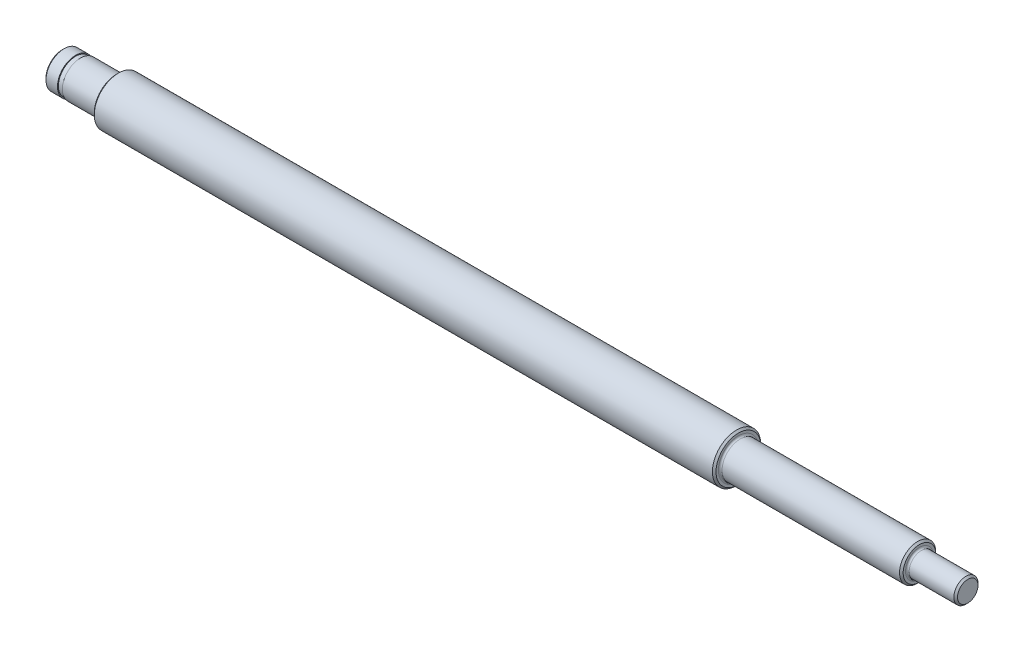
ISO-10303-21;
HEADER;
FILE_DESCRIPTION(('STEP AP214'),'2;1');
FILE_NAME('part.step','',(''),(''),'','','');
FILE_SCHEMA(('AUTOMOTIVE_DESIGN { 1 0 10303 214 1 1 1 1 }'));
ENDSEC;
DATA;
#1=APPLICATION_CONTEXT('core data for automotive mechanical design processes');
#2=APPLICATION_PROTOCOL_DEFINITION('international standard','automotive_design',2000,#1);
#3=PRODUCT_CONTEXT('',#1,'mechanical');
#4=PRODUCT('Part','Part','',(#3));
#5=PRODUCT_RELATED_PRODUCT_CATEGORY('part','',(#4));
#6=PRODUCT_DEFINITION_FORMATION('','',#4);
#7=PRODUCT_DEFINITION_CONTEXT('part definition',#1,'design');
#8=PRODUCT_DEFINITION('design','',#6,#7);
#9=PRODUCT_DEFINITION_SHAPE('','',#8);
#10=(LENGTH_UNIT() NAMED_UNIT(*) SI_UNIT(.MILLI.,.METRE.));
#11=(NAMED_UNIT(*) PLANE_ANGLE_UNIT() SI_UNIT($,.RADIAN.));
#12=(NAMED_UNIT(*) SI_UNIT($,.STERADIAN.) SOLID_ANGLE_UNIT());
#13=UNCERTAINTY_MEASURE_WITH_UNIT(LENGTH_MEASURE(1.E-05),#10,'distance_accuracy_value','');
#14=(GEOMETRIC_REPRESENTATION_CONTEXT(3) GLOBAL_UNCERTAINTY_ASSIGNED_CONTEXT((#13)) GLOBAL_UNIT_ASSIGNED_CONTEXT((#10,
#11,#12)) REPRESENTATION_CONTEXT('',''));
#15=CARTESIAN_POINT('',(0.,0.,0.));
#16=DIRECTION('',(0.,0.,1.));
#17=DIRECTION('',(1.,0.,0.));
#18=AXIS2_PLACEMENT_3D('',#15,#16,#17);
#19=CARTESIAN_POINT('',(9.,-3.7,3.7));
#20=DIRECTION('',(-1.,0.,0.));
#21=DIRECTION('',(0.,1.,0.));
#22=AXIS2_PLACEMENT_3D('',#19,#20,#21);
#23=PLANE('',#22);
#24=CARTESIAN_POINT('',(9.,0.,0.));
#25=DIRECTION('',(-1.,0.,0.));
#26=DIRECTION('',(0.,0.,-1.));
#27=AXIS2_PLACEMENT_3D('',#24,#25,#26);
#28=CIRCLE('',#27,3.7);
#29=CARTESIAN_POINT('',(9.,0.,-3.7));
#30=VERTEX_POINT('',#29);
#31=EDGE_CURVE('E79',#30,#30,#28,.F.);
#32=ORIENTED_EDGE('',*,*,#31,.F.);
#33=EDGE_LOOP('',(#32));
#34=FACE_BOUND('',#33,.T.);
#35=CARTESIAN_POINT('',(9.,0.,0.));
#36=DIRECTION('',(1.,0.,0.));
#37=DIRECTION('',(0.,0.,1.));
#38=AXIS2_PLACEMENT_3D('',#35,#36,#37);
#39=CIRCLE('',#38,3.3);
#40=CARTESIAN_POINT('',(9.,0.,3.3));
#41=VERTEX_POINT('',#40);
#42=EDGE_CURVE('E76',#41,#41,#39,.T.);
#43=ORIENTED_EDGE('',*,*,#42,.T.);
#44=EDGE_LOOP('',(#43));
#45=FACE_BOUND('',#44,.T.);
#46=ADVANCED_FACE('F14',(#34,#45),#23,.T.);
#47=CARTESIAN_POINT('',(112.,-3.69999982114199,-3.70000000000001));
#48=DIRECTION('',(1.,0.,0.));
#49=DIRECTION('',(0.,1.,0.));
#50=AXIS2_PLACEMENT_3D('',#47,#48,#49);
#51=PLANE('',#50);
#52=CARTESIAN_POINT('',(112.,0.,0.));
#53=DIRECTION('',(1.,0.,0.));
#54=DIRECTION('',(0.,-1.41721885398355E-07,0.99999999999999));
#55=AXIS2_PLACEMENT_3D('',#52,#53,#54);
#56=CIRCLE('',#55,3.7);
#57=CARTESIAN_POINT('',(112.,-5.24370975973913E-07,3.69999999999996));
#58=VERTEX_POINT('',#57);
#59=EDGE_CURVE('E73',#58,#58,#56,.T.);
#60=ORIENTED_EDGE('',*,*,#59,.T.);
#61=EDGE_LOOP('',(#60));
#62=FACE_BOUND('',#61,.T.);
#63=CARTESIAN_POINT('',(112.,0.,0.));
#64=DIRECTION('',(-1.,0.,0.));
#65=DIRECTION('',(0.,0.,-1.));
#66=AXIS2_PLACEMENT_3D('',#63,#64,#65);
#67=CIRCLE('',#66,3.30000017416462);
#68=CARTESIAN_POINT('',(112.,0.,-3.30000017416462));
#69=VERTEX_POINT('',#68);
#70=EDGE_CURVE('E70',#69,#69,#67,.F.);
#71=ORIENTED_EDGE('',*,*,#70,.F.);
#72=EDGE_LOOP('',(#71));
#73=FACE_BOUND('',#72,.T.);
#74=ADVANCED_FACE('F87',(#62,#73),#51,.T.);
#75=CARTESIAN_POINT('',(142.,-2.7,-2.7));
#76=DIRECTION('',(1.,0.,0.));
#77=DIRECTION('',(0.,1.,0.));
#78=AXIS2_PLACEMENT_3D('',#75,#76,#77);
#79=PLANE('',#78);
#80=CARTESIAN_POINT('',(142.,0.,0.));
#81=DIRECTION('',(1.,0.,0.));
#82=DIRECTION('',(0.,0.,1.));
#83=AXIS2_PLACEMENT_3D('',#80,#81,#82);
#84=CIRCLE('',#83,2.70000000000001);
#85=CARTESIAN_POINT('',(142.,0.,2.70000000000001));
#86=VERTEX_POINT('',#85);
#87=EDGE_CURVE('E67',#86,#86,#84,.T.);
#88=ORIENTED_EDGE('',*,*,#87,.T.);
#89=EDGE_LOOP('',(#88));
#90=FACE_BOUND('',#89,.T.);
#91=CARTESIAN_POINT('',(142.,0.,0.));
#92=DIRECTION('',(-1.,0.,0.));
#93=DIRECTION('',(0.,0.,-1.));
#94=AXIS2_PLACEMENT_3D('',#91,#92,#93);
#95=CIRCLE('',#94,2.30000007452861);
#96=CARTESIAN_POINT('',(142.,0.,-2.30000007452861));
#97=VERTEX_POINT('',#96);
#98=EDGE_CURVE('E64',#97,#97,#95,.F.);
#99=ORIENTED_EDGE('',*,*,#98,.F.);
#100=EDGE_LOOP('',(#99));
#101=FACE_BOUND('',#100,.T.);
#102=ADVANCED_FACE('F127',(#90,#101),#79,.T.);
#103=CARTESIAN_POINT('',(150.,-1.69999991770422,-1.7));
#104=DIRECTION('',(1.,0.,0.));
#105=DIRECTION('',(0.,1.,0.));
#106=AXIS2_PLACEMENT_3D('',#103,#104,#105);
#107=PLANE('',#106);
#108=CARTESIAN_POINT('',(150.,0.,0.));
#109=DIRECTION('',(1.,0.,0.));
#110=DIRECTION('',(0.,-1.41924995154891E-07,0.99999999999999));
#111=AXIS2_PLACEMENT_3D('',#108,#109,#110);
#112=CIRCLE('',#111,1.69999999999998);
#113=CARTESIAN_POINT('',(150.,-2.41272491763312E-07,1.69999999999997));
#114=VERTEX_POINT('',#113);
#115=EDGE_CURVE('E61',#114,#114,#112,.T.);
#116=ORIENTED_EDGE('',*,*,#115,.T.);
#117=EDGE_LOOP('',(#116));
#118=FACE_BOUND('',#117,.T.);
#119=ADVANCED_FACE('F120',(#118),#107,.T.);
#120=CARTESIAN_POINT('',(2.20000000000005,-2.99999985477215,-3.));
#121=DIRECTION('',(1.,0.,0.));
#122=DIRECTION('',(0.,1.,0.));
#123=AXIS2_PLACEMENT_3D('',#120,#121,#122);
#124=PLANE('',#123);
#125=CARTESIAN_POINT('',(2.20000000000005,0.,0.));
#126=DIRECTION('',(1.,0.,0.));
#127=DIRECTION('',(0.,-1.4192499930843E-07,0.99999999999999));
#128=AXIS2_PLACEMENT_3D('',#125,#126,#127);
#129=CIRCLE('',#128,3.);
#130=CARTESIAN_POINT('',(2.20000000000005,-4.2577499792529E-07,2.99999999999997));
#131=VERTEX_POINT('',#130);
#132=EDGE_CURVE('E58',#131,#131,#129,.F.);
#133=ORIENTED_EDGE('',*,*,#132,.F.);
#134=EDGE_LOOP('',(#133));
#135=FACE_BOUND('',#134,.T.);
#136=CARTESIAN_POINT('',(2.20000000000005,0.,0.));
#137=DIRECTION('',(-1.,0.,0.));
#138=DIRECTION('',(0.,0.,-1.));
#139=AXIS2_PLACEMENT_3D('',#136,#137,#138);
#140=CIRCLE('',#139,2.85);
#141=CARTESIAN_POINT('',(2.20000000000005,0.,-2.85));
#142=VERTEX_POINT('',#141);
#143=EDGE_CURVE('E55',#142,#142,#140,.F.);
#144=ORIENTED_EDGE('',*,*,#143,.F.);
#145=EDGE_LOOP('',(#144));
#146=FACE_BOUND('',#145,.T.);
#147=ADVANCED_FACE('F107',(#135,#146),#124,.T.);
#148=CARTESIAN_POINT('',(3.,-3.,3.));
#149=DIRECTION('',(-1.,0.,0.));
#150=DIRECTION('',(0.,1.,0.));
#151=AXIS2_PLACEMENT_3D('',#148,#149,#150);
#152=PLANE('',#151);
#153=CARTESIAN_POINT('',(3.,0.,0.));
#154=DIRECTION('',(-1.,0.,0.));
#155=DIRECTION('',(0.,0.,-1.));
#156=AXIS2_PLACEMENT_3D('',#153,#154,#155);
#157=CIRCLE('',#156,3.);
#158=CARTESIAN_POINT('',(3.,0.,-3.));
#159=VERTEX_POINT('',#158);
#160=EDGE_CURVE('E52',#159,#159,#157,.F.);
#161=ORIENTED_EDGE('',*,*,#160,.F.);
#162=EDGE_LOOP('',(#161));
#163=FACE_BOUND('',#162,.T.);
#164=CARTESIAN_POINT('',(3.,0.,0.));
#165=DIRECTION('',(1.,0.,0.));
#166=DIRECTION('',(0.,0.,1.));
#167=AXIS2_PLACEMENT_3D('',#164,#165,#166);
#168=CIRCLE('',#167,2.85);
#169=CARTESIAN_POINT('',(3.,0.,2.85));
#170=VERTEX_POINT('',#169);
#171=EDGE_CURVE('E49',#170,#170,#168,.T.);
#172=ORIENTED_EDGE('',*,*,#171,.T.);
#173=EDGE_LOOP('',(#172));
#174=FACE_BOUND('',#173,.T.);
#175=ADVANCED_FACE('F104',(#163,#174),#152,.T.);
#176=CARTESIAN_POINT('',(0.,-2.70000000000002,2.70000020708045));
#177=DIRECTION('',(-1.,0.,0.));
#178=DIRECTION('',(0.,1.,0.));
#179=AXIS2_PLACEMENT_3D('',#176,#177,#178);
#180=PLANE('',#179);
#181=CARTESIAN_POINT('',(0.,0.,0.));
#182=DIRECTION('',(-1.,0.,0.));
#183=DIRECTION('',(0.,0.,-1.));
#184=AXIS2_PLACEMENT_3D('',#181,#182,#183);
#185=CIRCLE('',#184,2.7);
#186=CARTESIAN_POINT('',(0.,0.,-2.7));
#187=VERTEX_POINT('',#186);
#188=EDGE_CURVE('E46',#187,#187,#185,.F.);
#189=ORIENTED_EDGE('',*,*,#188,.F.);
#190=EDGE_LOOP('',(#189));
#191=FACE_BOUND('',#190,.T.);
#192=ADVANCED_FACE('F100',(#191),#180,.T.);
#193=CARTESIAN_POINT('',(150.,0.,0.));
#194=DIRECTION('',(1.,0.,0.));
#195=DIRECTION('',(0.,1.92332050626273E-10,1.));
#196=AXIS2_PLACEMENT_3D('',#193,#194,#195);
#197=CYLINDRICAL_SURFACE('',#196,3.);
#198=CARTESIAN_POINT('',(8.69999999999999,0.,0.));
#199=DIRECTION('',(-1.,0.,0.));
#200=DIRECTION('',(0.,0.,-1.));
#201=AXIS2_PLACEMENT_3D('',#198,#199,#200);
#202=CIRCLE('',#201,3.);
#203=CARTESIAN_POINT('',(8.69999999999999,0.,-3.));
#204=VERTEX_POINT('',#203);
#205=EDGE_CURVE('E43',#204,#204,#202,.F.);
#206=ORIENTED_EDGE('',*,*,#205,.F.);
#207=EDGE_LOOP('',(#206));
#208=FACE_BOUND('',#207,.T.);
#209=ORIENTED_EDGE('',*,*,#160,.T.);
#210=EDGE_LOOP('',(#209));
#211=FACE_BOUND('',#210,.T.);
#212=ADVANCED_FACE('F94',(#208,#211),#197,.T.);
#213=CARTESIAN_POINT('',(8.70000000000012,0.,0.));
#214=DIRECTION('',(1.,0.,0.));
#215=DIRECTION('',(0.,1.92332050626273E-10,1.));
#216=AXIS2_PLACEMENT_3D('',#213,#214,#215);
#217=TOROIDAL_SURFACE('',#216,3.29999999999988,0.299999999999879);
#218=ORIENTED_EDGE('',*,*,#42,.F.);
#219=EDGE_LOOP('',(#218));
#220=FACE_BOUND('',#219,.T.);
#221=ORIENTED_EDGE('',*,*,#205,.T.);
#222=EDGE_LOOP('',(#221));
#223=FACE_BOUND('',#222,.T.);
#224=ADVANCED_FACE('F91',(#220,#223),#217,.F.);
#225=CARTESIAN_POINT('',(9.3,0.,0.));
#226=DIRECTION('',(1.,0.,0.));
#227=DIRECTION('',(0.,0.,1.));
#228=AXIS2_PLACEMENT_3D('',#225,#226,#227);
#229=CONICAL_SURFACE('',#228,4.00000000000001,0.785398163397456);
#230=CARTESIAN_POINT('',(9.3,0.,0.));
#231=DIRECTION('',(-1.,0.,0.));
#232=DIRECTION('',(0.,0.,-1.));
#233=AXIS2_PLACEMENT_3D('',#230,#231,#232);
#234=CIRCLE('',#233,4.);
#235=CARTESIAN_POINT('',(9.3,0.,-4.));
#236=VERTEX_POINT('',#235);
#237=EDGE_CURVE('E40',#236,#236,#234,.F.);
#238=ORIENTED_EDGE('',*,*,#237,.F.);
#239=EDGE_LOOP('',(#238));
#240=FACE_BOUND('',#239,.T.);
#241=ORIENTED_EDGE('',*,*,#31,.T.);
#242=EDGE_LOOP('',(#241));
#243=FACE_BOUND('',#242,.T.);
#244=ADVANCED_FACE('F83',(#240,#243),#229,.T.);
#245=CARTESIAN_POINT('',(150.,0.,0.));
#246=DIRECTION('',(1.,0.,0.));
#247=DIRECTION('',(0.,0.,1.));
#248=AXIS2_PLACEMENT_3D('',#245,#246,#247);
#249=CYLINDRICAL_SURFACE('',#248,4.);
#250=CARTESIAN_POINT('',(111.7,0.,0.));
#251=DIRECTION('',(-1.,0.,0.));
#252=DIRECTION('',(0.,0.,-1.));
#253=AXIS2_PLACEMENT_3D('',#250,#251,#252);
#254=CIRCLE('',#253,4.);
#255=CARTESIAN_POINT('',(111.7,0.,-4.));
#256=VERTEX_POINT('',#255);
#257=EDGE_CURVE('E37',#256,#256,#254,.F.);
#258=ORIENTED_EDGE('',*,*,#257,.F.);
#259=EDGE_LOOP('',(#258));
#260=FACE_BOUND('',#259,.T.);
#261=ORIENTED_EDGE('',*,*,#237,.T.);
#262=EDGE_LOOP('',(#261));
#263=FACE_BOUND('',#262,.T.);
#264=ADVANCED_FACE('F138',(#260,#263),#249,.T.);
#265=CARTESIAN_POINT('',(111.7,0.,0.));
#266=DIRECTION('',(-1.,0.,0.));
#267=DIRECTION('',(0.,0.,-1.));
#268=AXIS2_PLACEMENT_3D('',#265,#266,#267);
#269=CONICAL_SURFACE('',#268,4.,0.785398163397456);
#270=ORIENTED_EDGE('',*,*,#59,.F.);
#271=EDGE_LOOP('',(#270));
#272=FACE_BOUND('',#271,.T.);
#273=ORIENTED_EDGE('',*,*,#257,.T.);
#274=EDGE_LOOP('',(#273));
#275=FACE_BOUND('',#274,.T.);
#276=ADVANCED_FACE('F142',(#272,#275),#269,.T.);
#277=CARTESIAN_POINT('',(112.299999999993,0.,0.));
#278=DIRECTION('',(1.,0.,0.));
#279=DIRECTION('',(0.,0.,1.));
#280=AXIS2_PLACEMENT_3D('',#277,#278,#279);
#281=TOROIDAL_SURFACE('',#280,3.29999999999306,0.299999999993056);
#282=CARTESIAN_POINT('',(112.3,0.,0.));
#283=DIRECTION('',(-1.,0.,0.));
#284=DIRECTION('',(0.,0.,-1.));
#285=AXIS2_PLACEMENT_3D('',#282,#283,#284);
#286=CIRCLE('',#285,3.);
#287=CARTESIAN_POINT('',(112.3,0.,-3.));
#288=VERTEX_POINT('',#287);
#289=EDGE_CURVE('E34',#288,#288,#286,.F.);
#290=ORIENTED_EDGE('',*,*,#289,.F.);
#291=EDGE_LOOP('',(#290));
#292=FACE_BOUND('',#291,.T.);
#293=ORIENTED_EDGE('',*,*,#70,.T.);
#294=EDGE_LOOP('',(#293));
#295=FACE_BOUND('',#294,.T.);
#296=ADVANCED_FACE('F146',(#292,#295),#281,.F.);
#297=CARTESIAN_POINT('',(150.,0.,0.));
#298=DIRECTION('',(1.,0.,0.));
#299=DIRECTION('',(0.,0.,1.));
#300=AXIS2_PLACEMENT_3D('',#297,#298,#299);
#301=CYLINDRICAL_SURFACE('',#300,3.);
#302=CARTESIAN_POINT('',(141.7,0.,0.));
#303=DIRECTION('',(-1.,0.,0.));
#304=DIRECTION('',(0.,0.,-1.));
#305=AXIS2_PLACEMENT_3D('',#302,#303,#304);
#306=CIRCLE('',#305,3.);
#307=CARTESIAN_POINT('',(141.7,0.,-3.));
#308=VERTEX_POINT('',#307);
#309=EDGE_CURVE('E29',#308,#308,#306,.F.);
#310=ORIENTED_EDGE('',*,*,#309,.F.);
#311=EDGE_LOOP('',(#310));
#312=FACE_BOUND('',#311,.T.);
#313=ORIENTED_EDGE('',*,*,#289,.T.);
#314=EDGE_LOOP('',(#313));
#315=FACE_BOUND('',#314,.T.);
#316=ADVANCED_FACE('F150',(#312,#315),#301,.T.);
#317=CARTESIAN_POINT('',(141.7,0.,0.));
#318=DIRECTION('',(-1.,0.,0.));
#319=DIRECTION('',(0.,0.,-1.));
#320=AXIS2_PLACEMENT_3D('',#317,#318,#319);
#321=CONICAL_SURFACE('',#320,3.,0.785398163397411);
#322=ORIENTED_EDGE('',*,*,#87,.F.);
#323=EDGE_LOOP('',(#322));
#324=FACE_BOUND('',#323,.T.);
#325=ORIENTED_EDGE('',*,*,#309,.T.);
#326=EDGE_LOOP('',(#325));
#327=FACE_BOUND('',#326,.T.);
#328=ADVANCED_FACE('F154',(#324,#327),#321,.T.);
#329=CARTESIAN_POINT('',(142.299999999993,0.,0.));
#330=DIRECTION('',(1.,0.,0.));
#331=DIRECTION('',(0.,0.,1.));
#332=AXIS2_PLACEMENT_3D('',#329,#330,#331);
#333=TOROIDAL_SURFACE('',#332,2.299999999993,0.299999999993);
#334=CARTESIAN_POINT('',(142.3,0.,0.));
#335=DIRECTION('',(-1.,0.,0.));
#336=DIRECTION('',(0.,0.,-1.));
#337=AXIS2_PLACEMENT_3D('',#334,#335,#336);
#338=CIRCLE('',#337,2.);
#339=CARTESIAN_POINT('',(142.3,0.,-2.));
#340=VERTEX_POINT('',#339);
#341=EDGE_CURVE('E25',#340,#340,#338,.F.);
#342=ORIENTED_EDGE('',*,*,#341,.F.);
#343=EDGE_LOOP('',(#342));
#344=FACE_BOUND('',#343,.T.);
#345=ORIENTED_EDGE('',*,*,#98,.T.);
#346=EDGE_LOOP('',(#345));
#347=FACE_BOUND('',#346,.T.);
#348=ADVANCED_FACE('F158',(#344,#347),#333,.F.);
#349=CARTESIAN_POINT('',(150.,0.,0.));
#350=DIRECTION('',(1.,0.,0.));
#351=DIRECTION('',(0.,0.,1.));
#352=AXIS2_PLACEMENT_3D('',#349,#350,#351);
#353=CYLINDRICAL_SURFACE('',#352,2.);
#354=CARTESIAN_POINT('',(149.7,0.,0.));
#355=DIRECTION('',(-1.,0.,0.));
#356=DIRECTION('',(0.,0.,-1.));
#357=AXIS2_PLACEMENT_3D('',#354,#355,#356);
#358=CIRCLE('',#357,2.);
#359=CARTESIAN_POINT('',(149.7,0.,-2.));
#360=VERTEX_POINT('',#359);
#361=EDGE_CURVE('E21',#360,#360,#358,.F.);
#362=ORIENTED_EDGE('',*,*,#361,.F.);
#363=EDGE_LOOP('',(#362));
#364=FACE_BOUND('',#363,.T.);
#365=ORIENTED_EDGE('',*,*,#341,.T.);
#366=EDGE_LOOP('',(#365));
#367=FACE_BOUND('',#366,.T.);
#368=ADVANCED_FACE('F162',(#364,#367),#353,.T.);
#369=CARTESIAN_POINT('',(149.7,0.,0.));
#370=DIRECTION('',(-1.,0.,0.));
#371=DIRECTION('',(0.,0.,-1.));
#372=AXIS2_PLACEMENT_3D('',#369,#370,#371);
#373=CONICAL_SURFACE('',#372,2.,0.785398163397457);
#374=ORIENTED_EDGE('',*,*,#115,.F.);
#375=EDGE_LOOP('',(#374));
#376=FACE_BOUND('',#375,.T.);
#377=ORIENTED_EDGE('',*,*,#361,.T.);
#378=EDGE_LOOP('',(#377));
#379=FACE_BOUND('',#378,.T.);
#380=ADVANCED_FACE('F115',(#376,#379),#373,.T.);
#381=CARTESIAN_POINT('',(300.,0.,0.));
#382=DIRECTION('',(1.,0.,0.));
#383=DIRECTION('',(0.,0.,1.));
#384=AXIS2_PLACEMENT_3D('',#381,#382,#383);
#385=CYLINDRICAL_SURFACE('',#384,2.85);
#386=ORIENTED_EDGE('',*,*,#171,.F.);
#387=EDGE_LOOP('',(#386));
#388=FACE_BOUND('',#387,.T.);
#389=ORIENTED_EDGE('',*,*,#143,.T.);
#390=EDGE_LOOP('',(#389));
#391=FACE_BOUND('',#390,.T.);
#392=ADVANCED_FACE('F111',(#388,#391),#385,.T.);
#393=CARTESIAN_POINT('',(0.299999999999994,0.,0.));
#394=DIRECTION('',(1.,0.,0.));
#395=DIRECTION('',(0.,1.41914831120256E-07,0.99999999999999));
#396=AXIS2_PLACEMENT_3D('',#393,#394,#395);
#397=CONICAL_SURFACE('',#396,3.,0.785398163397458);
#398=CARTESIAN_POINT('',(0.299999999999994,0.,0.));
#399=DIRECTION('',(-1.,0.,0.));
#400=DIRECTION('',(0.,0.,-1.));
#401=AXIS2_PLACEMENT_3D('',#398,#399,#400);
#402=CIRCLE('',#401,3.);
#403=CARTESIAN_POINT('',(0.299999999999994,0.,-3.));
#404=VERTEX_POINT('',#403);
#405=EDGE_CURVE('E9',#404,#404,#402,.F.);
#406=ORIENTED_EDGE('',*,*,#405,.F.);
#407=EDGE_LOOP('',(#406));
#408=FACE_BOUND('',#407,.T.);
#409=ORIENTED_EDGE('',*,*,#188,.T.);
#410=EDGE_LOOP('',(#409));
#411=FACE_BOUND('',#410,.T.);
#412=ADVANCED_FACE('F114',(#408,#411),#397,.T.);
#413=CARTESIAN_POINT('',(150.,0.,0.));
#414=DIRECTION('',(1.,0.,0.));
#415=DIRECTION('',(0.,7.69327835111053E-10,1.));
#416=AXIS2_PLACEMENT_3D('',#413,#414,#415);
#417=CYLINDRICAL_SURFACE('',#416,3.);
#418=ORIENTED_EDGE('',*,*,#132,.T.);
#419=EDGE_LOOP('',(#418));
#420=FACE_BOUND('',#419,.T.);
#421=ORIENTED_EDGE('',*,*,#405,.T.);
#422=EDGE_LOOP('',(#421));
#423=FACE_BOUND('',#422,.T.);
#424=ADVANCED_FACE('F16',(#420,#423),#417,.T.);
#425=CLOSED_SHELL('',(#46,#74,#102,#119,#147,#175,#192,#212,#224,#244,#264,#276,#296,#316,#328,
#348,#368,#380,#392,#412,#424));
#426=MANIFOLD_SOLID_BREP('B1',#425);
#427=ADVANCED_BREP_SHAPE_REPRESENTATION('',(#18,#426),#14);
#428=SHAPE_DEFINITION_REPRESENTATION(#9,#427);
ENDSEC;
END-ISO-10303-21;
